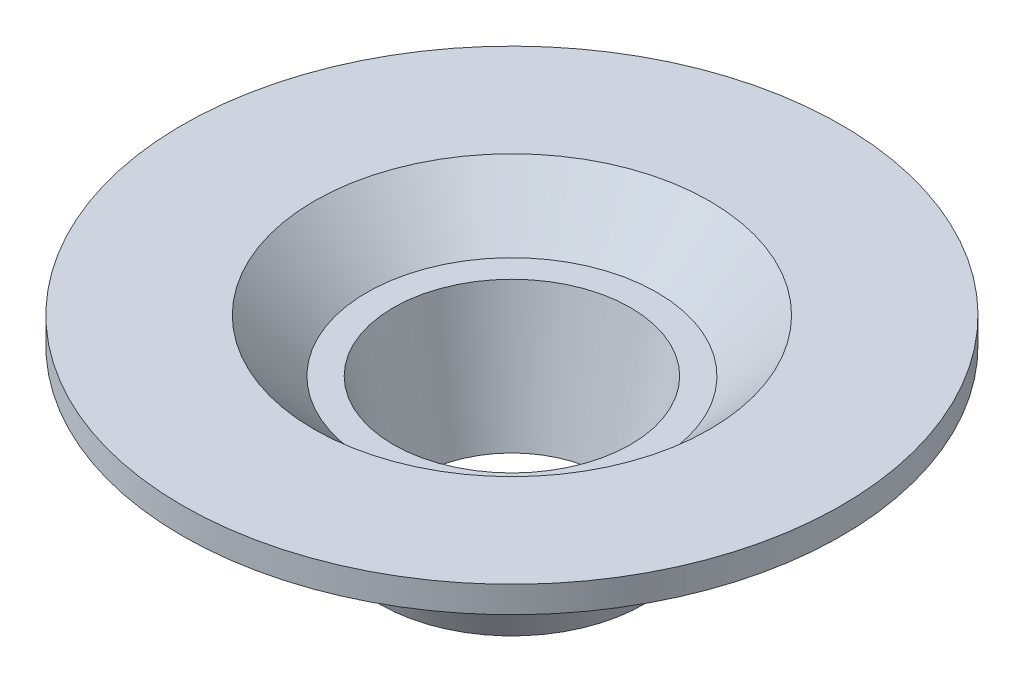
ISO-10303-21;
HEADER;
FILE_DESCRIPTION(('STEP AP214'),'2;1');
FILE_NAME('part.step','',(''),(''),'','','');
FILE_SCHEMA(('AUTOMOTIVE_DESIGN { 1 0 10303 214 1 1 1 1 }'));
ENDSEC;
DATA;
#1=APPLICATION_CONTEXT('core data for automotive mechanical design processes');
#2=APPLICATION_PROTOCOL_DEFINITION('international standard','automotive_design',2000,#1);
#3=PRODUCT_CONTEXT('',#1,'mechanical');
#4=PRODUCT('Part','Part','',(#3));
#5=PRODUCT_RELATED_PRODUCT_CATEGORY('part','',(#4));
#6=PRODUCT_DEFINITION_FORMATION('','',#4);
#7=PRODUCT_DEFINITION_CONTEXT('part definition',#1,'design');
#8=PRODUCT_DEFINITION('design','',#6,#7);
#9=PRODUCT_DEFINITION_SHAPE('','',#8);
#10=(LENGTH_UNIT() NAMED_UNIT(*) SI_UNIT(.MILLI.,.METRE.));
#11=(NAMED_UNIT(*) PLANE_ANGLE_UNIT() SI_UNIT($,.RADIAN.));
#12=(NAMED_UNIT(*) SI_UNIT($,.STERADIAN.) SOLID_ANGLE_UNIT());
#13=UNCERTAINTY_MEASURE_WITH_UNIT(LENGTH_MEASURE(1.E-05),#10,'distance_accuracy_value','');
#14=(GEOMETRIC_REPRESENTATION_CONTEXT(3) GLOBAL_UNCERTAINTY_ASSIGNED_CONTEXT((#13)) GLOBAL_UNIT_ASSIGNED_CONTEXT((#10,
#11,#12)) REPRESENTATION_CONTEXT('',''));
#15=CARTESIAN_POINT('',(0.,0.,0.));
#16=DIRECTION('',(0.,0.,1.));
#17=DIRECTION('',(1.,0.,0.));
#18=AXIS2_PLACEMENT_3D('',#15,#16,#17);
#19=CARTESIAN_POINT('',(0.,-20.,-20.));
#20=DIRECTION('',(0.,1.,0.));
#21=DIRECTION('',(0.,0.,1.));
#22=AXIS2_PLACEMENT_3D('',#19,#20,#21);
#23=PLANE('',#22);
#24=CARTESIAN_POINT('',(0.,-20.,0.));
#25=DIRECTION('',(0.,1.,0.));
#26=DIRECTION('',(0.,0.,1.));
#27=AXIS2_PLACEMENT_3D('',#24,#25,#26);
#28=CIRCLE('',#27,20.);
#29=CARTESIAN_POINT('',(0.,-20.,20.));
#30=VERTEX_POINT('',#29);
#31=EDGE_CURVE('E10',#30,#30,#28,.T.);
#32=ORIENTED_EDGE('',*,*,#31,.F.);
#33=EDGE_LOOP('',(#32));
#34=FACE_BOUND('',#33,.T.);
#35=CARTESIAN_POINT('',(0.,-20.,0.));
#36=DIRECTION('',(0.,1.,0.));
#37=DIRECTION('',(0.,0.,1.));
#38=AXIS2_PLACEMENT_3D('',#35,#36,#37);
#39=CIRCLE('',#38,14.);
#40=CARTESIAN_POINT('',(0.,-20.,14.));
#41=VERTEX_POINT('',#40);
#42=EDGE_CURVE('E67',#41,#41,#39,.T.);
#43=ORIENTED_EDGE('',*,*,#42,.T.);
#44=EDGE_LOOP('',(#43));
#45=FACE_BOUND('',#44,.T.);
#46=ADVANCED_FACE('F33',(#34,#45),#23,.F.);
#47=CARTESIAN_POINT('',(0.,-20.,0.));
#48=DIRECTION('',(0.,1.,0.));
#49=DIRECTION('',(0.,0.,1.));
#50=AXIS2_PLACEMENT_3D('',#47,#48,#49);
#51=CONICAL_SURFACE('',#50,20.,0.358770670270572);
#52=CARTESIAN_POINT('',(0.,-4.,0.));
#53=DIRECTION('',(0.,1.,0.));
#54=DIRECTION('',(0.,0.,1.));
#55=AXIS2_PLACEMENT_3D('',#52,#53,#54);
#56=CIRCLE('',#55,26.);
#57=CARTESIAN_POINT('',(0.,-4.00000000000001,26.));
#58=VERTEX_POINT('',#57);
#59=EDGE_CURVE('E39',#58,#58,#56,.T.);
#60=ORIENTED_EDGE('',*,*,#59,.F.);
#61=EDGE_LOOP('',(#60));
#62=FACE_BOUND('',#61,.T.);
#63=ORIENTED_EDGE('',*,*,#31,.T.);
#64=EDGE_LOOP('',(#63));
#65=FACE_BOUND('',#64,.T.);
#66=ADVANCED_FACE('F116',(#62,#65),#51,.T.);
#67=CARTESIAN_POINT('',(0.,-4.,-34.));
#68=DIRECTION('',(0.,1.,0.));
#69=DIRECTION('',(0.,0.,1.));
#70=AXIS2_PLACEMENT_3D('',#67,#68,#69);
#71=PLANE('',#70);
#72=CARTESIAN_POINT('',(0.,-4.00000000000001,0.));
#73=DIRECTION('',(0.,1.,0.));
#74=DIRECTION('',(0.,0.,1.));
#75=AXIS2_PLACEMENT_3D('',#72,#73,#74);
#76=CIRCLE('',#75,34.);
#77=CARTESIAN_POINT('',(0.,-4.00000000000001,34.));
#78=VERTEX_POINT('',#77);
#79=EDGE_CURVE('E43',#78,#78,#76,.T.);
#80=ORIENTED_EDGE('',*,*,#79,.F.);
#81=EDGE_LOOP('',(#80));
#82=FACE_BOUND('',#81,.T.);
#83=ORIENTED_EDGE('',*,*,#59,.T.);
#84=EDGE_LOOP('',(#83));
#85=FACE_BOUND('',#84,.T.);
#86=ADVANCED_FACE('F111',(#82,#85),#71,.F.);
#87=CARTESIAN_POINT('',(0.,-4.00000000000001,0.));
#88=DIRECTION('',(0.,1.,0.));
#89=DIRECTION('',(0.,0.,1.));
#90=AXIS2_PLACEMENT_3D('',#87,#88,#89);
#91=CONICAL_SURFACE('',#90,34.,0.785398163397448);
#92=CARTESIAN_POINT('',(0.,3.99999999999999,0.));
#93=DIRECTION('',(0.,1.,0.));
#94=DIRECTION('',(0.,0.,1.));
#95=AXIS2_PLACEMENT_3D('',#92,#93,#94);
#96=CIRCLE('',#95,42.);
#97=CARTESIAN_POINT('',(0.,3.99999999999999,42.));
#98=VERTEX_POINT('',#97);
#99=EDGE_CURVE('E47',#98,#98,#96,.T.);
#100=ORIENTED_EDGE('',*,*,#99,.F.);
#101=EDGE_LOOP('',(#100));
#102=FACE_BOUND('',#101,.T.);
#103=ORIENTED_EDGE('',*,*,#79,.T.);
#104=EDGE_LOOP('',(#103));
#105=FACE_BOUND('',#104,.T.);
#106=ADVANCED_FACE('F105',(#102,#105),#91,.T.);
#107=CARTESIAN_POINT('',(0.,4.,-42.));
#108=DIRECTION('',(0.,1.,0.));
#109=DIRECTION('',(0.,0.,1.));
#110=AXIS2_PLACEMENT_3D('',#107,#108,#109);
#111=PLANE('',#110);
#112=CARTESIAN_POINT('',(0.,3.99999999999999,0.));
#113=DIRECTION('',(0.,1.,0.));
#114=DIRECTION('',(0.,0.,1.));
#115=AXIS2_PLACEMENT_3D('',#112,#113,#114);
#116=CIRCLE('',#115,50.);
#117=CARTESIAN_POINT('',(0.,3.99999999999999,50.));
#118=VERTEX_POINT('',#117);
#119=EDGE_CURVE('E52',#118,#118,#116,.T.);
#120=ORIENTED_EDGE('',*,*,#119,.F.);
#121=EDGE_LOOP('',(#120));
#122=FACE_BOUND('',#121,.T.);
#123=ORIENTED_EDGE('',*,*,#99,.T.);
#124=EDGE_LOOP('',(#123));
#125=FACE_BOUND('',#124,.T.);
#126=ADVANCED_FACE('F99',(#122,#125),#111,.F.);
#127=CARTESIAN_POINT('',(0.,0.,0.));
#128=DIRECTION('',(0.,1.,0.));
#129=DIRECTION('',(0.,0.,1.));
#130=AXIS2_PLACEMENT_3D('',#127,#128,#129);
#131=CYLINDRICAL_SURFACE('',#130,50.);
#132=CARTESIAN_POINT('',(0.,7.99999999999999,0.));
#133=DIRECTION('',(0.,1.,0.));
#134=DIRECTION('',(0.,0.,1.));
#135=AXIS2_PLACEMENT_3D('',#132,#133,#134);
#136=CIRCLE('',#135,50.);
#137=CARTESIAN_POINT('',(0.,7.99999999999999,50.));
#138=VERTEX_POINT('',#137);
#139=EDGE_CURVE('E55',#138,#138,#136,.T.);
#140=ORIENTED_EDGE('',*,*,#139,.F.);
#141=EDGE_LOOP('',(#140));
#142=FACE_BOUND('',#141,.T.);
#143=ORIENTED_EDGE('',*,*,#119,.T.);
#144=EDGE_LOOP('',(#143));
#145=FACE_BOUND('',#144,.T.);
#146=ADVANCED_FACE('F93',(#142,#145),#131,.T.);
#147=CARTESIAN_POINT('',(0.,8.,-30.));
#148=DIRECTION('',(0.,-1.,0.));
#149=DIRECTION('',(0.,0.,-1.));
#150=AXIS2_PLACEMENT_3D('',#147,#148,#149);
#151=PLANE('',#150);
#152=CARTESIAN_POINT('',(0.,8.,0.));
#153=DIRECTION('',(0.,1.,0.));
#154=DIRECTION('',(0.,0.,1.));
#155=AXIS2_PLACEMENT_3D('',#152,#153,#154);
#156=CIRCLE('',#155,30.);
#157=CARTESIAN_POINT('',(0.,7.99999999999999,30.));
#158=VERTEX_POINT('',#157);
#159=EDGE_CURVE('E58',#158,#158,#156,.T.);
#160=ORIENTED_EDGE('',*,*,#159,.F.);
#161=EDGE_LOOP('',(#160));
#162=FACE_BOUND('',#161,.T.);
#163=ORIENTED_EDGE('',*,*,#139,.T.);
#164=EDGE_LOOP('',(#163));
#165=FACE_BOUND('',#164,.T.);
#166=ADVANCED_FACE('F87',(#162,#165),#151,.F.);
#167=CARTESIAN_POINT('',(0.,8.,0.));
#168=DIRECTION('',(0.,1.,0.));
#169=DIRECTION('',(0.,0.,1.));
#170=AXIS2_PLACEMENT_3D('',#167,#168,#169);
#171=CONICAL_SURFACE('',#170,30.,0.785398163397448);
#172=CARTESIAN_POINT('',(0.,0.,0.));
#173=DIRECTION('',(0.,1.,0.));
#174=DIRECTION('',(0.,0.,1.));
#175=AXIS2_PLACEMENT_3D('',#172,#173,#174);
#176=CIRCLE('',#175,22.);
#177=CARTESIAN_POINT('',(0.,0.,22.));
#178=VERTEX_POINT('',#177);
#179=EDGE_CURVE('E61',#178,#178,#176,.T.);
#180=ORIENTED_EDGE('',*,*,#179,.F.);
#181=EDGE_LOOP('',(#180));
#182=FACE_BOUND('',#181,.T.);
#183=ORIENTED_EDGE('',*,*,#159,.T.);
#184=EDGE_LOOP('',(#183));
#185=FACE_BOUND('',#184,.T.);
#186=ADVANCED_FACE('F81',(#182,#185),#171,.F.);
#187=CARTESIAN_POINT('',(0.,0.,-18.));
#188=DIRECTION('',(0.,-1.,0.));
#189=DIRECTION('',(0.,0.,-1.));
#190=AXIS2_PLACEMENT_3D('',#187,#188,#189);
#191=PLANE('',#190);
#192=CARTESIAN_POINT('',(0.,0.,0.));
#193=DIRECTION('',(0.,1.,0.));
#194=DIRECTION('',(0.,0.,1.));
#195=AXIS2_PLACEMENT_3D('',#192,#193,#194);
#196=CIRCLE('',#195,18.);
#197=CARTESIAN_POINT('',(0.,0.,18.));
#198=VERTEX_POINT('',#197);
#199=EDGE_CURVE('E64',#198,#198,#196,.T.);
#200=ORIENTED_EDGE('',*,*,#199,.F.);
#201=EDGE_LOOP('',(#200));
#202=FACE_BOUND('',#201,.T.);
#203=ORIENTED_EDGE('',*,*,#179,.T.);
#204=EDGE_LOOP('',(#203));
#205=FACE_BOUND('',#204,.T.);
#206=ADVANCED_FACE('F75',(#202,#205),#191,.F.);
#207=CARTESIAN_POINT('',(0.,0.,0.));
#208=DIRECTION('',(0.,1.,0.));
#209=DIRECTION('',(0.,0.,1.));
#210=AXIS2_PLACEMENT_3D('',#207,#208,#209);
#211=CONICAL_SURFACE('',#210,18.,0.197395559849881);
#212=ORIENTED_EDGE('',*,*,#42,.F.);
#213=EDGE_LOOP('',(#212));
#214=FACE_BOUND('',#213,.T.);
#215=ORIENTED_EDGE('',*,*,#199,.T.);
#216=EDGE_LOOP('',(#215));
#217=FACE_BOUND('',#216,.T.);
#218=ADVANCED_FACE('F72',(#214,#217),#211,.F.);
#219=CLOSED_SHELL('',(#46,#66,#86,#106,#126,#146,#166,#186,#206,#218));
#220=MANIFOLD_SOLID_BREP('B2',#219);
#221=ADVANCED_BREP_SHAPE_REPRESENTATION('',(#18,#220),#14);
#222=SHAPE_DEFINITION_REPRESENTATION(#9,#221);
ENDSEC;
END-ISO-10303-21;
